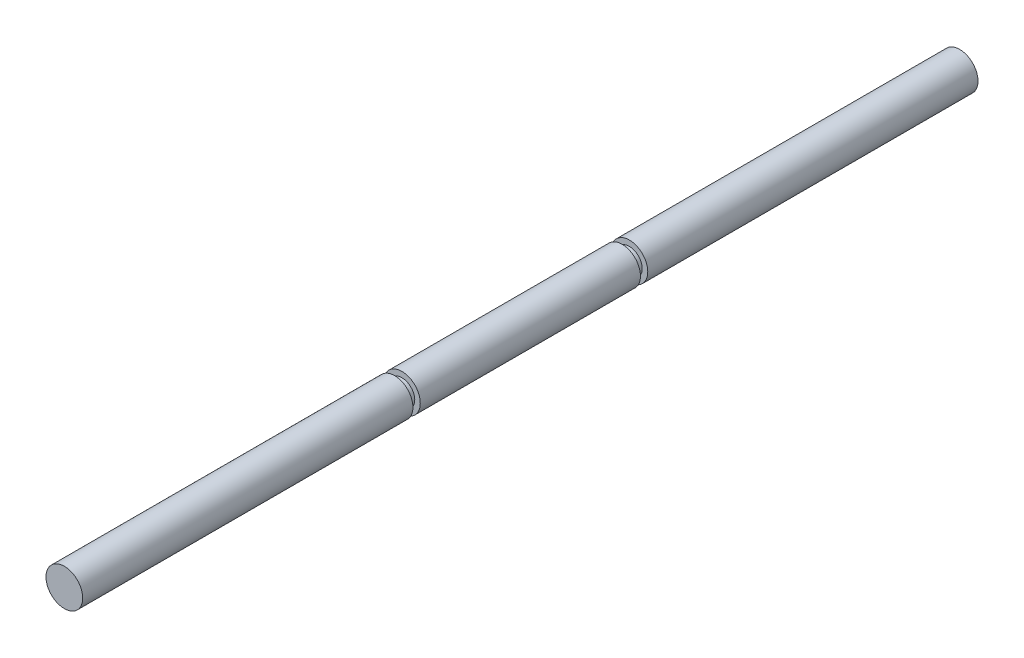
ISO-10303-21;
HEADER;
FILE_DESCRIPTION(('STEP AP214'),'2;1');
FILE_NAME('part.step','',(''),(''),'','','');
FILE_SCHEMA(('AUTOMOTIVE_DESIGN { 1 0 10303 214 1 1 1 1 }'));
ENDSEC;
DATA;
#1=APPLICATION_CONTEXT('core data for automotive mechanical design processes');
#2=APPLICATION_PROTOCOL_DEFINITION('international standard','automotive_design',2000,#1);
#3=PRODUCT_CONTEXT('',#1,'mechanical');
#4=PRODUCT('Part','Part','',(#3));
#5=PRODUCT_RELATED_PRODUCT_CATEGORY('part','',(#4));
#6=PRODUCT_DEFINITION_FORMATION('','',#4);
#7=PRODUCT_DEFINITION_CONTEXT('part definition',#1,'design');
#8=PRODUCT_DEFINITION('design','',#6,#7);
#9=PRODUCT_DEFINITION_SHAPE('','',#8);
#10=(LENGTH_UNIT() NAMED_UNIT(*) SI_UNIT(.MILLI.,.METRE.));
#11=(NAMED_UNIT(*) PLANE_ANGLE_UNIT() SI_UNIT($,.RADIAN.));
#12=(NAMED_UNIT(*) SI_UNIT($,.STERADIAN.) SOLID_ANGLE_UNIT());
#13=UNCERTAINTY_MEASURE_WITH_UNIT(LENGTH_MEASURE(1.E-05),#10,'distance_accuracy_value','');
#14=(GEOMETRIC_REPRESENTATION_CONTEXT(3) GLOBAL_UNCERTAINTY_ASSIGNED_CONTEXT((#13)) GLOBAL_UNIT_ASSIGNED_CONTEXT((#10,
#11,#12)) REPRESENTATION_CONTEXT('',''));
#15=CARTESIAN_POINT('',(0.,0.,0.));
#16=DIRECTION('',(0.,0.,1.));
#17=DIRECTION('',(1.,0.,0.));
#18=AXIS2_PLACEMENT_3D('',#15,#16,#17);
#19=CARTESIAN_POINT('',(0.,0.,60.));
#20=DIRECTION('',(0.,0.,-1.));
#21=DIRECTION('',(-1.,0.,0.));
#22=AXIS2_PLACEMENT_3D('',#19,#20,#21);
#23=CYLINDRICAL_SURFACE('',#22,5.);
#24=CARTESIAN_POINT('',(0.,0.,60.));
#25=DIRECTION('',(0.,0.,1.));
#26=DIRECTION('',(1.,0.,0.));
#27=AXIS2_PLACEMENT_3D('',#24,#25,#26);
#28=CIRCLE('',#27,5.);
#29=CARTESIAN_POINT('',(5.,0.,60.));
#30=VERTEX_POINT('',#29);
#31=EDGE_CURVE('E51',#30,#30,#28,.T.);
#32=ORIENTED_EDGE('',*,*,#31,.F.);
#33=EDGE_LOOP('',(#32));
#34=FACE_BOUND('',#33,.T.);
#35=CARTESIAN_POINT('',(0.,0.,0.));
#36=DIRECTION('',(0.,0.,1.));
#37=DIRECTION('',(1.,0.,0.));
#38=AXIS2_PLACEMENT_3D('',#35,#36,#37);
#39=CIRCLE('',#38,5.);
#40=CARTESIAN_POINT('',(5.,0.,0.));
#41=VERTEX_POINT('',#40);
#42=EDGE_CURVE('E40',#41,#41,#39,.T.);
#43=ORIENTED_EDGE('',*,*,#42,.T.);
#44=EDGE_LOOP('',(#43));
#45=FACE_BOUND('',#44,.T.);
#46=ADVANCED_FACE('F37',(#34,#45),#23,.T.);
#47=CARTESIAN_POINT('',(0.,0.,60.));
#48=DIRECTION('',(0.,0.,1.));
#49=DIRECTION('',(1.,0.,0.));
#50=AXIS2_PLACEMENT_3D('',#47,#48,#49);
#51=PLANE('',#50);
#52=CARTESIAN_POINT('',(0.,0.,60.));
#53=DIRECTION('',(0.,0.,1.));
#54=DIRECTION('',(1.,0.,0.));
#55=AXIS2_PLACEMENT_3D('',#52,#53,#54);
#56=CIRCLE('',#55,3.5);
#57=CARTESIAN_POINT('',(3.5,0.,60.));
#58=VERTEX_POINT('',#57);
#59=EDGE_CURVE('E45',#58,#58,#56,.T.);
#60=ORIENTED_EDGE('',*,*,#59,.F.);
#61=EDGE_LOOP('',(#60));
#62=FACE_BOUND('',#61,.T.);
#63=ORIENTED_EDGE('',*,*,#31,.T.);
#64=EDGE_LOOP('',(#63));
#65=FACE_BOUND('',#64,.T.);
#66=ADVANCED_FACE('F72',(#62,#65),#51,.T.);
#67=CARTESIAN_POINT('',(0.,0.,0.));
#68=DIRECTION('',(0.,0.,1.));
#69=DIRECTION('',(1.,0.,0.));
#70=AXIS2_PLACEMENT_3D('',#67,#68,#69);
#71=PLANE('',#70);
#72=CARTESIAN_POINT('',(0.,0.,0.));
#73=DIRECTION('',(0.,0.,-1.));
#74=DIRECTION('',(-1.,0.,0.));
#75=AXIS2_PLACEMENT_3D('',#72,#73,#74);
#76=CIRCLE('',#75,3.5);
#77=CARTESIAN_POINT('',(-3.5,0.,0.));
#78=VERTEX_POINT('',#77);
#79=EDGE_CURVE('E10',#78,#78,#76,.T.);
#80=ORIENTED_EDGE('',*,*,#79,.F.);
#81=EDGE_LOOP('',(#80));
#82=FACE_BOUND('',#81,.T.);
#83=ORIENTED_EDGE('',*,*,#42,.F.);
#84=EDGE_LOOP('',(#83));
#85=FACE_BOUND('',#84,.T.);
#86=ADVANCED_FACE('F69',(#82,#85),#71,.F.);
#87=CARTESIAN_POINT('',(0.,0.,62.));
#88=DIRECTION('',(0.,0.,-1.));
#89=DIRECTION('',(-1.,0.,0.));
#90=AXIS2_PLACEMENT_3D('',#87,#88,#89);
#91=CYLINDRICAL_SURFACE('',#90,3.5);
#92=CARTESIAN_POINT('',(0.,0.,62.));
#93=DIRECTION('',(0.,0.,1.));
#94=DIRECTION('',(1.,0.,0.));
#95=AXIS2_PLACEMENT_3D('',#92,#93,#94);
#96=CIRCLE('',#95,3.5);
#97=CARTESIAN_POINT('',(3.5,0.,62.));
#98=VERTEX_POINT('',#97);
#99=EDGE_CURVE('E57',#98,#98,#96,.T.);
#100=ORIENTED_EDGE('',*,*,#99,.F.);
#101=EDGE_LOOP('',(#100));
#102=FACE_BOUND('',#101,.T.);
#103=ORIENTED_EDGE('',*,*,#59,.T.);
#104=EDGE_LOOP('',(#103));
#105=FACE_BOUND('',#104,.T.);
#106=ADVANCED_FACE('F71',(#102,#105),#91,.T.);
#107=CARTESIAN_POINT('',(0.,0.,-2.));
#108=DIRECTION('',(0.,0.,1.));
#109=DIRECTION('',(1.,0.,0.));
#110=AXIS2_PLACEMENT_3D('',#107,#108,#109);
#111=CYLINDRICAL_SURFACE('',#110,3.5);
#112=CARTESIAN_POINT('',(0.,0.,-2.));
#113=DIRECTION('',(0.,0.,-1.));
#114=DIRECTION('',(-1.,0.,0.));
#115=AXIS2_PLACEMENT_3D('',#112,#113,#114);
#116=CIRCLE('',#115,3.5);
#117=CARTESIAN_POINT('',(-3.5,0.,-2.));
#118=VERTEX_POINT('',#117);
#119=EDGE_CURVE('E55',#118,#118,#116,.T.);
#120=ORIENTED_EDGE('',*,*,#119,.F.);
#121=EDGE_LOOP('',(#120));
#122=FACE_BOUND('',#121,.T.);
#123=ORIENTED_EDGE('',*,*,#79,.T.);
#124=EDGE_LOOP('',(#123));
#125=FACE_BOUND('',#124,.T.);
#126=ADVANCED_FACE('F78',(#122,#125),#111,.T.);
#127=CARTESIAN_POINT('',(0.,0.,-92.));
#128=DIRECTION('',(0.,0.,1.));
#129=DIRECTION('',(1.,0.,0.));
#130=AXIS2_PLACEMENT_3D('',#127,#128,#129);
#131=CYLINDRICAL_SURFACE('',#130,5.);
#132=CARTESIAN_POINT('',(0.,0.,-92.));
#133=DIRECTION('',(0.,0.,-1.));
#134=DIRECTION('',(-1.,0.,0.));
#135=AXIS2_PLACEMENT_3D('',#132,#133,#134);
#136=CIRCLE('',#135,5.);
#137=CARTESIAN_POINT('',(5.,0.,-92.));
#138=VERTEX_POINT('',#137);
#139=EDGE_CURVE('E188',#138,#138,#136,.T.);
#140=CARTESIAN_POINT('',(0.,0.,-2.));
#141=DIRECTION('',(0.,0.,-1.));
#142=DIRECTION('',(-1.,0.,0.));
#143=AXIS2_PLACEMENT_3D('',#140,#141,#142);
#144=CIRCLE('',#143,5.);
#145=CARTESIAN_POINT('',(5.,0.,-1.99999999999999));
#146=VERTEX_POINT('',#145);
#147=EDGE_CURVE('E185',#146,#146,#144,.T.);
#148=CARTESIAN_POINT('',(5.,0.,-92.));
#149=CARTESIAN_POINT('',(5.,0.,-91.0625));
#150=CARTESIAN_POINT('',(5.,0.,-90.125));
#151=CARTESIAN_POINT('',(5.,0.,-88.25));
#152=CARTESIAN_POINT('',(5.,0.,-87.3125));
#153=CARTESIAN_POINT('',(5.,0.,-85.4375));
#154=CARTESIAN_POINT('',(5.,0.,-84.5));
#155=CARTESIAN_POINT('',(5.,0.,-82.625));
#156=CARTESIAN_POINT('',(5.,0.,-81.6875));
#157=CARTESIAN_POINT('',(5.,0.,-79.8125));
#158=CARTESIAN_POINT('',(5.,0.,-78.875));
#159=CARTESIAN_POINT('',(5.,0.,-77.));
#160=CARTESIAN_POINT('',(5.,0.,-76.0625));
#161=CARTESIAN_POINT('',(5.,0.,-74.1875));
#162=CARTESIAN_POINT('',(5.,0.,-73.25));
#163=CARTESIAN_POINT('',(5.,0.,-71.375));
#164=CARTESIAN_POINT('',(5.,0.,-70.4375));
#165=CARTESIAN_POINT('',(5.,0.,-68.5625));
#166=CARTESIAN_POINT('',(5.,0.,-67.625));
#167=CARTESIAN_POINT('',(5.,0.,-65.75));
#168=CARTESIAN_POINT('',(5.,0.,-64.8125));
#169=CARTESIAN_POINT('',(5.,0.,-62.9375));
#170=CARTESIAN_POINT('',(5.,0.,-62.));
#171=CARTESIAN_POINT('',(5.,0.,-60.125));
#172=CARTESIAN_POINT('',(5.,0.,-59.1875));
#173=CARTESIAN_POINT('',(5.,0.,-57.3125));
#174=CARTESIAN_POINT('',(5.,0.,-56.375));
#175=CARTESIAN_POINT('',(5.,0.,-54.5));
#176=CARTESIAN_POINT('',(5.,0.,-53.5625));
#177=CARTESIAN_POINT('',(5.,0.,-51.6875));
#178=CARTESIAN_POINT('',(5.,0.,-50.75));
#179=CARTESIAN_POINT('',(5.,0.,-48.875));
#180=CARTESIAN_POINT('',(5.,0.,-47.9375));
#181=CARTESIAN_POINT('',(5.,0.,-46.0625));
#182=CARTESIAN_POINT('',(5.,0.,-45.125));
#183=CARTESIAN_POINT('',(5.,0.,-43.25));
#184=CARTESIAN_POINT('',(5.,0.,-42.3125));
#185=CARTESIAN_POINT('',(5.,0.,-40.4375));
#186=CARTESIAN_POINT('',(5.,0.,-39.5));
#187=CARTESIAN_POINT('',(5.,0.,-37.625));
#188=CARTESIAN_POINT('',(5.,0.,-36.6875));
#189=CARTESIAN_POINT('',(5.,0.,-34.8125));
#190=CARTESIAN_POINT('',(5.,0.,-33.875));
#191=CARTESIAN_POINT('',(5.,0.,-32.));
#192=CARTESIAN_POINT('',(5.,0.,-31.0625));
#193=CARTESIAN_POINT('',(5.,0.,-29.1875));
#194=CARTESIAN_POINT('',(5.,0.,-28.25));
#195=CARTESIAN_POINT('',(5.,0.,-26.375));
#196=CARTESIAN_POINT('',(5.,0.,-25.4375));
#197=CARTESIAN_POINT('',(5.,0.,-23.5625));
#198=CARTESIAN_POINT('',(5.,0.,-22.625));
#199=CARTESIAN_POINT('',(5.,0.,-20.75));
#200=CARTESIAN_POINT('',(5.,0.,-19.8125));
#201=CARTESIAN_POINT('',(5.,0.,-17.9375));
#202=CARTESIAN_POINT('',(5.,0.,-17.));
#203=CARTESIAN_POINT('',(5.,0.,-15.125));
#204=CARTESIAN_POINT('',(5.,0.,-14.1875));
#205=CARTESIAN_POINT('',(5.,0.,-12.3125));
#206=CARTESIAN_POINT('',(5.,0.,-11.375));
#207=CARTESIAN_POINT('',(5.,0.,-9.49999999999999));
#208=CARTESIAN_POINT('',(5.,0.,-8.56249999999999));
#209=CARTESIAN_POINT('',(5.,0.,-6.68749999999999));
#210=CARTESIAN_POINT('',(5.,0.,-5.74999999999999));
#211=CARTESIAN_POINT('',(5.,0.,-3.87499999999999));
#212=CARTESIAN_POINT('',(5.,0.,-2.93749999999999));
#213=CARTESIAN_POINT('',(5.,0.,-1.99999999999999));
#214=B_SPLINE_CURVE_WITH_KNOTS('',3,(#148,#149,#150,#151,#152,#153,#154,#155,#156,#157,#158,
#159,#160,#161,#162,#163,#164,#165,#166,#167,#168,#169,#170,#171,#172,#173,#174,#175,#176,#177,
#178,#179,#180,#181,#182,#183,#184,#185,#186,#187,#188,#189,#190,#191,#192,#193,#194,#195,#196,
#197,#198,#199,#200,#201,#202,#203,#204,#205,#206,#207,#208,#209,#210,#211,#212,#213),
.UNSPECIFIED.,.F.,.F.,(4,2,2,2,2,2,2,2,2,2,2,2,2,2,2,2,2,2,2,2,2,2,2,2,2,2,2,2,2,2,2,2,4),(0.,
2.8125,5.62499999999999,8.43749999999999,11.25,14.0625,16.875,19.6875,22.5,25.3125,28.125,
30.9375,33.75,36.5625,39.375,42.1875,45.,47.8125,50.625,53.4375,56.25,59.0625,61.875,64.6875,
67.5,70.3125,73.125,75.9375,78.75,81.5625,84.375,87.1875,90.),.UNSPECIFIED.);
#215=EDGE_CURVE('BSEAM110',#138,#146,#214,.T.);
#216=ORIENTED_EDGE('',*,*,#139,.F.);
#217=ORIENTED_EDGE('',*,*,#147,.T.);
#218=ORIENTED_EDGE('',*,*,#215,.T.);
#219=ORIENTED_EDGE('',*,*,#215,.F.);
#220=EDGE_LOOP('',(#216,#218,#217,#219));
#221=FACE_BOUND('',#220,.T.);
#222=ADVANCED_FACE('F110',(#221),#131,.T.);
#223=CARTESIAN_POINT('',(0.,0.,-92.));
#224=DIRECTION('',(0.,0.,-1.));
#225=DIRECTION('',(-1.,0.,0.));
#226=AXIS2_PLACEMENT_3D('',#223,#224,#225);
#227=PLANE('',#226);
#228=ORIENTED_EDGE('',*,*,#139,.T.);
#229=EDGE_LOOP('',(#228));
#230=FACE_BOUND('',#229,.T.);
#231=ADVANCED_FACE('F120',(#230),#227,.T.);
#232=CARTESIAN_POINT('',(0.,0.,-2.));
#233=DIRECTION('',(0.,0.,-1.));
#234=DIRECTION('',(-1.,0.,0.));
#235=AXIS2_PLACEMENT_3D('',#232,#233,#234);
#236=PLANE('',#235);
#237=ORIENTED_EDGE('',*,*,#119,.T.);
#238=EDGE_LOOP('',(#237));
#239=FACE_BOUND('',#238,.T.);
#240=ORIENTED_EDGE('',*,*,#147,.F.);
#241=EDGE_LOOP('',(#240));
#242=FACE_BOUND('',#241,.T.);
#243=ADVANCED_FACE('F130',(#239,#242),#236,.F.);
#244=CARTESIAN_POINT('',(0.,0.,152.));
#245=DIRECTION('',(0.,0.,-1.));
#246=DIRECTION('',(-1.,0.,0.));
#247=AXIS2_PLACEMENT_3D('',#244,#245,#246);
#248=CYLINDRICAL_SURFACE('',#247,5.);
#249=CARTESIAN_POINT('',(0.,0.,152.));
#250=DIRECTION('',(0.,0.,1.));
#251=DIRECTION('',(1.,0.,0.));
#252=AXIS2_PLACEMENT_3D('',#249,#250,#251);
#253=CIRCLE('',#252,5.);
#254=CARTESIAN_POINT('',(-5.,0.,152.));
#255=VERTEX_POINT('',#254);
#256=EDGE_CURVE('E181',#255,#255,#253,.T.);
#257=CARTESIAN_POINT('',(0.,0.,62.));
#258=DIRECTION('',(0.,0.,1.));
#259=DIRECTION('',(1.,0.,0.));
#260=AXIS2_PLACEMENT_3D('',#257,#258,#259);
#261=CIRCLE('',#260,5.);
#262=CARTESIAN_POINT('',(-5.,0.,62.));
#263=VERTEX_POINT('',#262);
#264=EDGE_CURVE('E178',#263,#263,#261,.T.);
#265=CARTESIAN_POINT('',(-5.,0.,152.));
#266=CARTESIAN_POINT('',(-5.,0.,151.0625));
#267=CARTESIAN_POINT('',(-5.,0.,150.125));
#268=CARTESIAN_POINT('',(-5.,0.,148.25));
#269=CARTESIAN_POINT('',(-5.,0.,147.3125));
#270=CARTESIAN_POINT('',(-5.,0.,145.4375));
#271=CARTESIAN_POINT('',(-5.,0.,144.5));
#272=CARTESIAN_POINT('',(-5.,0.,142.625));
#273=CARTESIAN_POINT('',(-5.,0.,141.6875));
#274=CARTESIAN_POINT('',(-5.,0.,139.8125));
#275=CARTESIAN_POINT('',(-5.,0.,138.875));
#276=CARTESIAN_POINT('',(-5.,0.,137.));
#277=CARTESIAN_POINT('',(-5.,0.,136.0625));
#278=CARTESIAN_POINT('',(-5.,0.,134.1875));
#279=CARTESIAN_POINT('',(-5.,0.,133.25));
#280=CARTESIAN_POINT('',(-5.,0.,131.375));
#281=CARTESIAN_POINT('',(-5.,0.,130.4375));
#282=CARTESIAN_POINT('',(-5.,0.,128.5625));
#283=CARTESIAN_POINT('',(-5.,0.,127.625));
#284=CARTESIAN_POINT('',(-5.,0.,125.75));
#285=CARTESIAN_POINT('',(-5.,0.,124.8125));
#286=CARTESIAN_POINT('',(-5.,0.,122.9375));
#287=CARTESIAN_POINT('',(-5.,0.,122.));
#288=CARTESIAN_POINT('',(-5.,0.,120.125));
#289=CARTESIAN_POINT('',(-5.,0.,119.1875));
#290=CARTESIAN_POINT('',(-5.,0.,117.3125));
#291=CARTESIAN_POINT('',(-5.,0.,116.375));
#292=CARTESIAN_POINT('',(-5.,0.,114.5));
#293=CARTESIAN_POINT('',(-5.,0.,113.5625));
#294=CARTESIAN_POINT('',(-5.,0.,111.6875));
#295=CARTESIAN_POINT('',(-5.,0.,110.75));
#296=CARTESIAN_POINT('',(-5.,0.,108.875));
#297=CARTESIAN_POINT('',(-5.,0.,107.9375));
#298=CARTESIAN_POINT('',(-5.,0.,106.0625));
#299=CARTESIAN_POINT('',(-5.,0.,105.125));
#300=CARTESIAN_POINT('',(-5.,0.,103.25));
#301=CARTESIAN_POINT('',(-5.,0.,102.3125));
#302=CARTESIAN_POINT('',(-5.,0.,100.4375));
#303=CARTESIAN_POINT('',(-5.,0.,99.5));
#304=CARTESIAN_POINT('',(-5.,0.,97.625));
#305=CARTESIAN_POINT('',(-5.,0.,96.6875));
#306=CARTESIAN_POINT('',(-5.,0.,94.8125));
#307=CARTESIAN_POINT('',(-5.,0.,93.875));
#308=CARTESIAN_POINT('',(-5.,0.,92.));
#309=CARTESIAN_POINT('',(-5.,0.,91.0625));
#310=CARTESIAN_POINT('',(-5.,0.,89.1875));
#311=CARTESIAN_POINT('',(-5.,0.,88.25));
#312=CARTESIAN_POINT('',(-5.,0.,86.375));
#313=CARTESIAN_POINT('',(-5.,0.,85.4375));
#314=CARTESIAN_POINT('',(-5.,0.,83.5625));
#315=CARTESIAN_POINT('',(-5.,0.,82.625));
#316=CARTESIAN_POINT('',(-5.,0.,80.75));
#317=CARTESIAN_POINT('',(-5.,0.,79.8125));
#318=CARTESIAN_POINT('',(-5.,0.,77.9375));
#319=CARTESIAN_POINT('',(-5.,0.,77.));
#320=CARTESIAN_POINT('',(-5.,0.,75.125));
#321=CARTESIAN_POINT('',(-5.,0.,74.1875));
#322=CARTESIAN_POINT('',(-5.,0.,72.3125));
#323=CARTESIAN_POINT('',(-5.,0.,71.375));
#324=CARTESIAN_POINT('',(-5.,0.,69.5));
#325=CARTESIAN_POINT('',(-5.,0.,68.5625));
#326=CARTESIAN_POINT('',(-5.,0.,66.6875));
#327=CARTESIAN_POINT('',(-5.,0.,65.75));
#328=CARTESIAN_POINT('',(-5.,0.,63.875));
#329=CARTESIAN_POINT('',(-5.,0.,62.9375));
#330=CARTESIAN_POINT('',(-5.,0.,62.));
#331=B_SPLINE_CURVE_WITH_KNOTS('',3,(#265,#266,#267,#268,#269,#270,#271,#272,#273,#274,#275,
#276,#277,#278,#279,#280,#281,#282,#283,#284,#285,#286,#287,#288,#289,#290,#291,#292,#293,#294,
#295,#296,#297,#298,#299,#300,#301,#302,#303,#304,#305,#306,#307,#308,#309,#310,#311,#312,#313,
#314,#315,#316,#317,#318,#319,#320,#321,#322,#323,#324,#325,#326,#327,#328,#329,#330),
.UNSPECIFIED.,.F.,.F.,(4,2,2,2,2,2,2,2,2,2,2,2,2,2,2,2,2,2,2,2,2,2,2,2,2,2,2,2,2,2,2,2,4),(0.,
2.81250000000002,5.62500000000002,8.43750000000001,11.25,14.0625,16.875,19.6875,22.5,25.3125,
28.125,30.9375,33.75,36.5625,39.375,42.1875,45.,47.8125,50.625,53.4375,56.25,59.0625,61.875,
64.6875,67.5,70.3125,73.125,75.9375,78.75,81.5625,84.375,87.1875,90.),.UNSPECIFIED.);
#332=EDGE_CURVE('BSEAM140',#255,#263,#331,.T.);
#333=ORIENTED_EDGE('',*,*,#256,.F.);
#334=ORIENTED_EDGE('',*,*,#264,.T.);
#335=ORIENTED_EDGE('',*,*,#332,.T.);
#336=ORIENTED_EDGE('',*,*,#332,.F.);
#337=EDGE_LOOP('',(#333,#335,#334,#336));
#338=FACE_BOUND('',#337,.T.);
#339=ADVANCED_FACE('F140',(#338),#248,.T.);
#340=CARTESIAN_POINT('',(0.,0.,152.));
#341=DIRECTION('',(0.,0.,1.));
#342=DIRECTION('',(1.,0.,0.));
#343=AXIS2_PLACEMENT_3D('',#340,#341,#342);
#344=PLANE('',#343);
#345=ORIENTED_EDGE('',*,*,#256,.T.);
#346=EDGE_LOOP('',(#345));
#347=FACE_BOUND('',#346,.T.);
#348=ADVANCED_FACE('F150',(#347),#344,.T.);
#349=CARTESIAN_POINT('',(0.,0.,62.));
#350=DIRECTION('',(0.,0.,1.));
#351=DIRECTION('',(1.,0.,0.));
#352=AXIS2_PLACEMENT_3D('',#349,#350,#351);
#353=PLANE('',#352);
#354=ORIENTED_EDGE('',*,*,#99,.T.);
#355=EDGE_LOOP('',(#354));
#356=FACE_BOUND('',#355,.T.);
#357=ORIENTED_EDGE('',*,*,#264,.F.);
#358=EDGE_LOOP('',(#357));
#359=FACE_BOUND('',#358,.T.);
#360=ADVANCED_FACE('F160',(#356,#359),#353,.F.);
#361=CLOSED_SHELL('',(#46,#66,#86,#106,#126,#222,#231,#243,#339,#348,#360));
#362=MANIFOLD_SOLID_BREP('B2',#361);
#363=ADVANCED_BREP_SHAPE_REPRESENTATION('',(#18,#362),#14);
#364=SHAPE_DEFINITION_REPRESENTATION(#9,#363);
ENDSEC;
END-ISO-10303-21;
